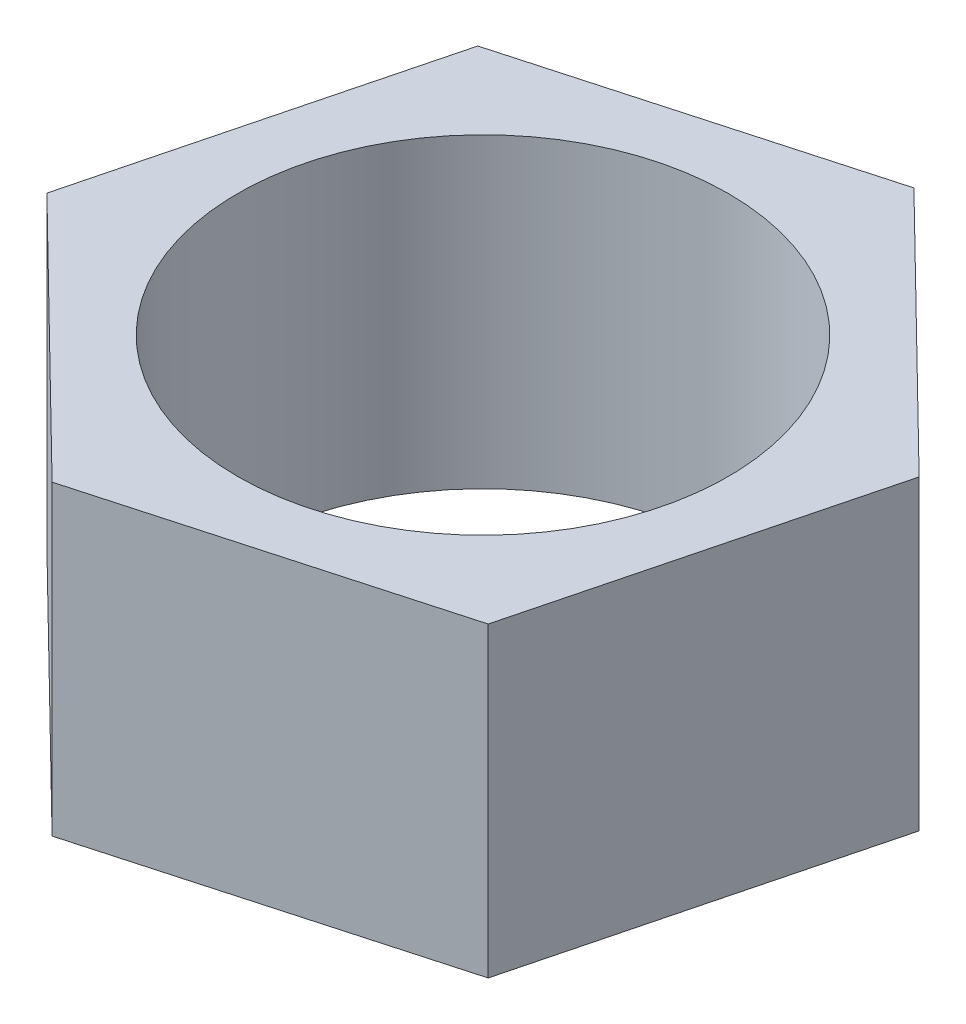
ISO-10303-21;
HEADER;
FILE_DESCRIPTION(('STEP AP214'),'2;1');
FILE_NAME('part.step','',(''),(''),'','','');
FILE_SCHEMA(('AUTOMOTIVE_DESIGN { 1 0 10303 214 1 1 1 1 }'));
ENDSEC;
DATA;
#1=APPLICATION_CONTEXT('core data for automotive mechanical design processes');
#2=APPLICATION_PROTOCOL_DEFINITION('international standard','automotive_design',2000,#1);
#3=PRODUCT_CONTEXT('',#1,'mechanical');
#4=PRODUCT('Part','Part','',(#3));
#5=PRODUCT_RELATED_PRODUCT_CATEGORY('part','',(#4));
#6=PRODUCT_DEFINITION_FORMATION('','',#4);
#7=PRODUCT_DEFINITION_CONTEXT('part definition',#1,'design');
#8=PRODUCT_DEFINITION('design','',#6,#7);
#9=PRODUCT_DEFINITION_SHAPE('','',#8);
#10=(LENGTH_UNIT() NAMED_UNIT(*) SI_UNIT(.MILLI.,.METRE.));
#11=(NAMED_UNIT(*) PLANE_ANGLE_UNIT() SI_UNIT($,.RADIAN.));
#12=(NAMED_UNIT(*) SI_UNIT($,.STERADIAN.) SOLID_ANGLE_UNIT());
#13=UNCERTAINTY_MEASURE_WITH_UNIT(LENGTH_MEASURE(1.E-05),#10,'distance_accuracy_value','');
#14=(GEOMETRIC_REPRESENTATION_CONTEXT(3) GLOBAL_UNCERTAINTY_ASSIGNED_CONTEXT((#13)) GLOBAL_UNIT_ASSIGNED_CONTEXT((#10,
#11,#12)) REPRESENTATION_CONTEXT('',''));
#15=CARTESIAN_POINT('',(0.,0.,0.));
#16=DIRECTION('',(0.,0.,1.));
#17=DIRECTION('',(1.,0.,0.));
#18=AXIS2_PLACEMENT_3D('',#15,#16,#17);
#19=CARTESIAN_POINT('',(0.,5.,0.));
#20=DIRECTION('',(0.,1.,0.));
#21=DIRECTION('',(0.,0.,1.));
#22=AXIS2_PLACEMENT_3D('',#19,#20,#21);
#23=PLANE('',#22);
#24=DIRECTION('',(0.963177540260773,0.,-0.26886618593123));
#25=VECTOR('',#24,1.);
#26=CARTESIAN_POINT('',(-1.43612313107864,5.,5.59203752542079));
#27=LINE('',#26,#25);
#28=CARTESIAN_POINT('',(-1.43612313107864,5.,5.59203752542079));
#29=VERTEX_POINT('',#28);
#30=CARTESIAN_POINT('',(4.12478499039095,5.,4.03973787718695));
#31=VERTEX_POINT('',#30);
#32=EDGE_CURVE('E146',#29,#31,#27,.T.);
#33=ORIENTED_EDGE('',*,*,#32,.T.);
#34=DIRECTION('',(0.248743822895311,0.,-0.968569311186053));
#35=VECTOR('',#34,1.);
#36=CARTESIAN_POINT('',(4.12478499039095,5.,4.03973787718695));
#37=LINE('',#36,#35);
#38=CARTESIAN_POINT('',(5.56090812146959,5.,-1.55229964823384));
#39=VERTEX_POINT('',#38);
#40=EDGE_CURVE('E94',#31,#39,#37,.T.);
#41=ORIENTED_EDGE('',*,*,#40,.T.);
#42=DIRECTION('',(-0.714433717365462,0.,-0.699703125254823));
#43=VECTOR('',#42,1.);
#44=CARTESIAN_POINT('',(5.56090812146959,5.,-1.55229964823384));
#45=LINE('',#44,#43);
#46=CARTESIAN_POINT('',(1.43612313107864,5.,-5.59203752542079));
#47=VERTEX_POINT('',#46);
#48=EDGE_CURVE('E107',#39,#47,#45,.T.);
#49=ORIENTED_EDGE('',*,*,#48,.T.);
#50=DIRECTION('',(-0.963177540260773,0.,0.26886618593123));
#51=VECTOR('',#50,1.);
#52=CARTESIAN_POINT('',(1.43612313107864,5.,-5.59203752542079));
#53=LINE('',#52,#51);
#54=CARTESIAN_POINT('',(-4.12478499039095,5.,-4.03973787718695));
#55=VERTEX_POINT('',#54);
#56=EDGE_CURVE('E101',#47,#55,#53,.T.);
#57=ORIENTED_EDGE('',*,*,#56,.T.);
#58=DIRECTION('',(-0.248743822895311,0.,0.968569311186054));
#59=VECTOR('',#58,1.);
#60=CARTESIAN_POINT('',(-4.12478499039095,5.,-4.03973787718695));
#61=LINE('',#60,#59);
#62=CARTESIAN_POINT('',(-5.56090812146959,5.,1.55229964823384));
#63=VERTEX_POINT('',#62);
#64=EDGE_CURVE('E105',#55,#63,#61,.T.);
#65=ORIENTED_EDGE('',*,*,#64,.T.);
#66=DIRECTION('',(0.714433717365462,0.,0.699703125254823));
#67=VECTOR('',#66,1.);
#68=CARTESIAN_POINT('',(-5.56090812146959,5.,1.55229964823384));
#69=LINE('',#68,#67);
#70=EDGE_CURVE('E57',#63,#29,#69,.T.);
#71=ORIENTED_EDGE('',*,*,#70,.T.);
#72=EDGE_LOOP('',(#33,#41,#49,#57,#65,#71));
#73=FACE_BOUND('',#72,.T.);
#74=CARTESIAN_POINT('',(0.,5.,0.));
#75=DIRECTION('',(0.,1.,0.));
#76=DIRECTION('',(0.,0.,1.));
#77=AXIS2_PLACEMENT_3D('',#74,#75,#76);
#78=CIRCLE('',#77,4.);
#79=CARTESIAN_POINT('',(0.,5.,4.));
#80=VERTEX_POINT('',#79);
#81=EDGE_CURVE('E134',#80,#80,#78,.T.);
#82=ORIENTED_EDGE('',*,*,#81,.F.);
#83=EDGE_LOOP('',(#82));
#84=FACE_BOUND('',#83,.T.);
#85=ADVANCED_FACE('F39',(#73,#84),#23,.T.);
#86=CARTESIAN_POINT('',(0.,0.,0.));
#87=DIRECTION('',(0.,1.,0.));
#88=DIRECTION('',(0.,0.,1.));
#89=AXIS2_PLACEMENT_3D('',#86,#87,#88);
#90=PLANE('',#89);
#91=DIRECTION('',(0.963177540260773,0.,-0.26886618593123));
#92=VECTOR('',#91,1.);
#93=CARTESIAN_POINT('',(-1.43612313107864,0.,5.59203752542079));
#94=LINE('',#93,#92);
#95=CARTESIAN_POINT('',(-1.43612313107864,0.,5.59203752542079));
#96=VERTEX_POINT('',#95);
#97=CARTESIAN_POINT('',(4.12478499039095,0.,4.03973787718695));
#98=VERTEX_POINT('',#97);
#99=EDGE_CURVE('E129',#96,#98,#94,.T.);
#100=ORIENTED_EDGE('',*,*,#99,.F.);
#101=DIRECTION('',(0.714433717365462,0.,0.699703125254823));
#102=VECTOR('',#101,1.);
#103=CARTESIAN_POINT('',(-5.56090812146959,0.,1.55229964823384));
#104=LINE('',#103,#102);
#105=CARTESIAN_POINT('',(-5.56090812146959,0.,1.55229964823384));
#106=VERTEX_POINT('',#105);
#107=EDGE_CURVE('E86',#106,#96,#104,.T.);
#108=ORIENTED_EDGE('',*,*,#107,.F.);
#109=DIRECTION('',(-0.248743822895311,0.,0.968569311186054));
#110=VECTOR('',#109,1.);
#111=CARTESIAN_POINT('',(-4.12478499039095,0.,-4.03973787718695));
#112=LINE('',#111,#110);
#113=CARTESIAN_POINT('',(-4.12478499039095,0.,-4.03973787718695));
#114=VERTEX_POINT('',#113);
#115=EDGE_CURVE('E80',#114,#106,#112,.T.);
#116=ORIENTED_EDGE('',*,*,#115,.F.);
#117=DIRECTION('',(-0.963177540260773,0.,0.26886618593123));
#118=VECTOR('',#117,1.);
#119=CARTESIAN_POINT('',(1.43612313107864,0.,-5.59203752542079));
#120=LINE('',#119,#118);
#121=CARTESIAN_POINT('',(1.43612313107864,0.,-5.59203752542079));
#122=VERTEX_POINT('',#121);
#123=EDGE_CURVE('E116',#122,#114,#120,.T.);
#124=ORIENTED_EDGE('',*,*,#123,.F.);
#125=DIRECTION('',(-0.714433717365462,0.,-0.699703125254823));
#126=VECTOR('',#125,1.);
#127=CARTESIAN_POINT('',(5.56090812146959,0.,-1.55229964823384));
#128=LINE('',#127,#126);
#129=CARTESIAN_POINT('',(5.56090812146959,0.,-1.55229964823384));
#130=VERTEX_POINT('',#129);
#131=EDGE_CURVE('E137',#130,#122,#128,.T.);
#132=ORIENTED_EDGE('',*,*,#131,.F.);
#133=DIRECTION('',(0.248743822895311,0.,-0.968569311186053));
#134=VECTOR('',#133,1.);
#135=CARTESIAN_POINT('',(4.12478499039095,0.,4.03973787718695));
#136=LINE('',#135,#134);
#137=EDGE_CURVE('E133',#98,#130,#136,.T.);
#138=ORIENTED_EDGE('',*,*,#137,.F.);
#139=EDGE_LOOP('',(#100,#108,#116,#124,#132,#138));
#140=FACE_BOUND('',#139,.T.);
#141=CARTESIAN_POINT('',(0.,0.,0.));
#142=DIRECTION('',(0.,1.,0.));
#143=DIRECTION('',(0.,0.,1.));
#144=AXIS2_PLACEMENT_3D('',#141,#142,#143);
#145=CIRCLE('',#144,4.);
#146=CARTESIAN_POINT('',(0.,0.,4.));
#147=VERTEX_POINT('',#146);
#148=EDGE_CURVE('E243',#147,#147,#145,.T.);
#149=ORIENTED_EDGE('',*,*,#148,.T.);
#150=EDGE_LOOP('',(#149));
#151=FACE_BOUND('',#150,.T.);
#152=ADVANCED_FACE('F159',(#140,#151),#90,.F.);
#153=CARTESIAN_POINT('',(-1.43612313107864,5.,5.59203752542079));
#154=DIRECTION('',(-0.26886618593123,0.,-0.963177540260773));
#155=DIRECTION('',(-0.963177540260773,0.,0.26886618593123));
#156=AXIS2_PLACEMENT_3D('',#153,#154,#155);
#157=PLANE('',#156);
#158=ORIENTED_EDGE('',*,*,#99,.T.);
#159=DIRECTION('',(0.,-1.,0.));
#160=VECTOR('',#159,1.);
#161=CARTESIAN_POINT('',(4.12478499039095,5.,4.03973787718695));
#162=LINE('',#161,#160);
#163=EDGE_CURVE('E11',#31,#98,#162,.T.);
#164=ORIENTED_EDGE('',*,*,#163,.F.);
#165=ORIENTED_EDGE('',*,*,#32,.F.);
#166=DIRECTION('',(0.,-1.,0.));
#167=VECTOR('',#166,1.);
#168=CARTESIAN_POINT('',(-1.43612313107864,5.,5.59203752542079));
#169=LINE('',#168,#167);
#170=EDGE_CURVE('E125',#29,#96,#169,.T.);
#171=ORIENTED_EDGE('',*,*,#170,.T.);
#172=EDGE_LOOP('',(#158,#164,#165,#171));
#173=FACE_BOUND('',#172,.T.);
#174=ADVANCED_FACE('F41',(#173),#157,.F.);
#175=CARTESIAN_POINT('',(4.12478499039095,5.,4.03973787718695));
#176=DIRECTION('',(-0.968569311186053,0.,-0.248743822895311));
#177=DIRECTION('',(-0.248743822895311,0.,0.968569311186054));
#178=AXIS2_PLACEMENT_3D('',#175,#176,#177);
#179=PLANE('',#178);
#180=ORIENTED_EDGE('',*,*,#137,.T.);
#181=DIRECTION('',(0.,-1.,0.));
#182=VECTOR('',#181,1.);
#183=CARTESIAN_POINT('',(5.56090812146959,5.,-1.55229964823384));
#184=LINE('',#183,#182);
#185=EDGE_CURVE('E49',#39,#130,#184,.T.);
#186=ORIENTED_EDGE('',*,*,#185,.F.);
#187=ORIENTED_EDGE('',*,*,#40,.F.);
#188=ORIENTED_EDGE('',*,*,#163,.T.);
#189=EDGE_LOOP('',(#180,#186,#187,#188));
#190=FACE_BOUND('',#189,.T.);
#191=ADVANCED_FACE('F184',(#190),#179,.F.);
#192=CARTESIAN_POINT('',(5.56090812146959,5.,-1.55229964823384));
#193=DIRECTION('',(-0.699703125254823,0.,0.714433717365462));
#194=DIRECTION('',(0.714433717365462,0.,0.699703125254823));
#195=AXIS2_PLACEMENT_3D('',#192,#193,#194);
#196=PLANE('',#195);
#197=ORIENTED_EDGE('',*,*,#131,.T.);
#198=DIRECTION('',(0.,-1.,0.));
#199=VECTOR('',#198,1.);
#200=CARTESIAN_POINT('',(1.43612313107864,5.,-5.59203752542079));
#201=LINE('',#200,#199);
#202=EDGE_CURVE('E118',#47,#122,#201,.T.);
#203=ORIENTED_EDGE('',*,*,#202,.F.);
#204=ORIENTED_EDGE('',*,*,#48,.F.);
#205=ORIENTED_EDGE('',*,*,#185,.T.);
#206=EDGE_LOOP('',(#197,#203,#204,#205));
#207=FACE_BOUND('',#206,.T.);
#208=ADVANCED_FACE('F156',(#207),#196,.F.);
#209=CARTESIAN_POINT('',(1.43612313107864,5.,-5.59203752542079));
#210=DIRECTION('',(0.26886618593123,0.,0.963177540260773));
#211=DIRECTION('',(0.963177540260773,0.,-0.26886618593123));
#212=AXIS2_PLACEMENT_3D('',#209,#210,#211);
#213=PLANE('',#212);
#214=ORIENTED_EDGE('',*,*,#123,.T.);
#215=DIRECTION('',(0.,-1.,0.));
#216=VECTOR('',#215,1.);
#217=CARTESIAN_POINT('',(-4.12478499039095,5.,-4.03973787718695));
#218=LINE('',#217,#216);
#219=EDGE_CURVE('E113',#55,#114,#218,.T.);
#220=ORIENTED_EDGE('',*,*,#219,.F.);
#221=ORIENTED_EDGE('',*,*,#56,.F.);
#222=ORIENTED_EDGE('',*,*,#202,.T.);
#223=EDGE_LOOP('',(#214,#220,#221,#222));
#224=FACE_BOUND('',#223,.T.);
#225=ADVANCED_FACE('F114',(#224),#213,.F.);
#226=CARTESIAN_POINT('',(-4.12478499039095,5.,-4.03973787718695));
#227=DIRECTION('',(0.968569311186054,0.,0.248743822895311));
#228=DIRECTION('',(0.248743822895311,0.,-0.968569311186054));
#229=AXIS2_PLACEMENT_3D('',#226,#227,#228);
#230=PLANE('',#229);
#231=ORIENTED_EDGE('',*,*,#115,.T.);
#232=DIRECTION('',(0.,-1.,0.));
#233=VECTOR('',#232,1.);
#234=CARTESIAN_POINT('',(-5.56090812146959,5.,1.55229964823384));
#235=LINE('',#234,#233);
#236=EDGE_CURVE('E119',#63,#106,#235,.T.);
#237=ORIENTED_EDGE('',*,*,#236,.F.);
#238=ORIENTED_EDGE('',*,*,#64,.F.);
#239=ORIENTED_EDGE('',*,*,#219,.T.);
#240=EDGE_LOOP('',(#231,#237,#238,#239));
#241=FACE_BOUND('',#240,.T.);
#242=ADVANCED_FACE('F121',(#241),#230,.F.);
#243=CARTESIAN_POINT('',(-5.56090812146959,5.,1.55229964823384));
#244=DIRECTION('',(0.699703125254823,0.,-0.714433717365462));
#245=DIRECTION('',(-0.714433717365462,0.,-0.699703125254823));
#246=AXIS2_PLACEMENT_3D('',#243,#244,#245);
#247=PLANE('',#246);
#248=ORIENTED_EDGE('',*,*,#107,.T.);
#249=ORIENTED_EDGE('',*,*,#170,.F.);
#250=ORIENTED_EDGE('',*,*,#70,.F.);
#251=ORIENTED_EDGE('',*,*,#236,.T.);
#252=EDGE_LOOP('',(#248,#249,#250,#251));
#253=FACE_BOUND('',#252,.T.);
#254=ADVANCED_FACE('F164',(#253),#247,.F.);
#255=CARTESIAN_POINT('',(0.,5.,0.));
#256=DIRECTION('',(0.,-1.,0.));
#257=DIRECTION('',(0.,0.,-1.));
#258=AXIS2_PLACEMENT_3D('',#255,#256,#257);
#259=CYLINDRICAL_SURFACE('',#258,4.);
#260=ORIENTED_EDGE('',*,*,#81,.T.);
#261=EDGE_LOOP('',(#260));
#262=FACE_BOUND('',#261,.T.);
#263=ORIENTED_EDGE('',*,*,#148,.F.);
#264=EDGE_LOOP('',(#263));
#265=FACE_BOUND('',#264,.T.);
#266=ADVANCED_FACE('F166',(#262,#265),#259,.F.);
#267=CLOSED_SHELL('',(#85,#152,#174,#191,#208,#225,#242,#254,#266));
#268=MANIFOLD_SOLID_BREP('B2',#267);
#269=ADVANCED_BREP_SHAPE_REPRESENTATION('',(#18,#268),#14);
#270=SHAPE_DEFINITION_REPRESENTATION(#9,#269);
ENDSEC;
END-ISO-10303-21;
